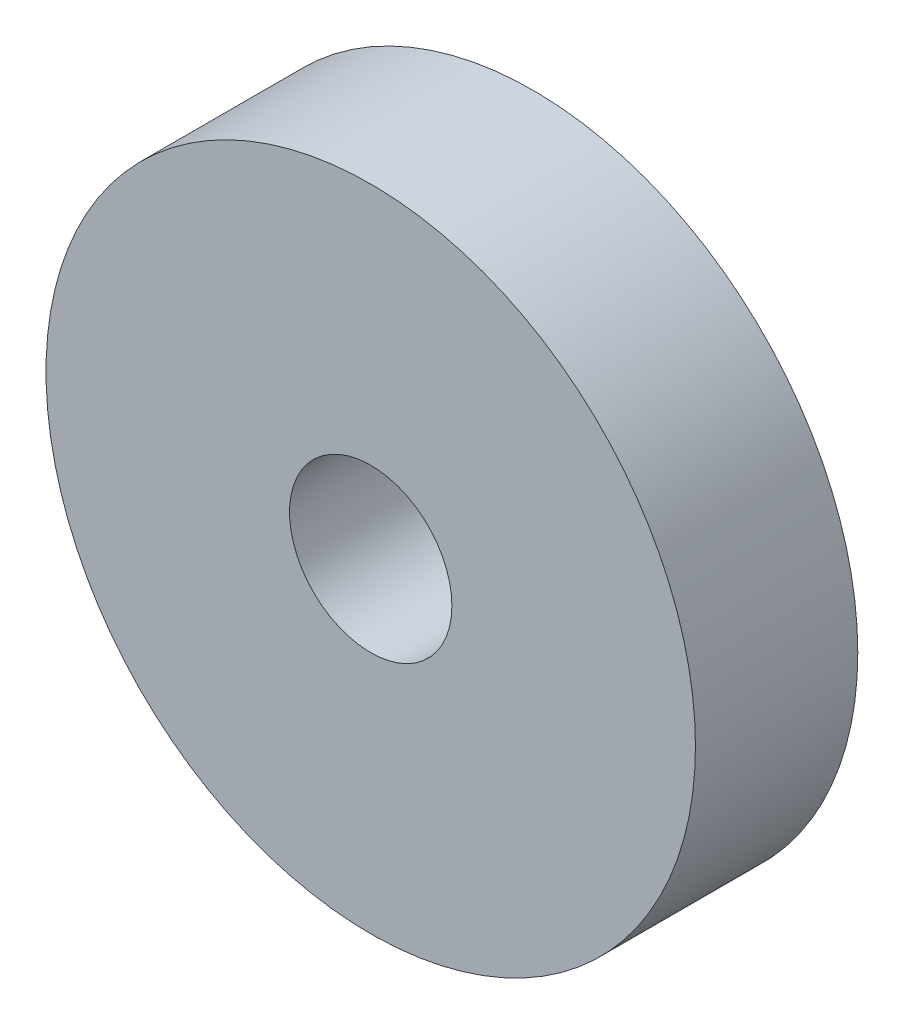
ISO-10303-21;
HEADER;
FILE_DESCRIPTION(('STEP AP214'),'2;1');
FILE_NAME('part.step','',(''),(''),'','','');
FILE_SCHEMA(('AUTOMOTIVE_DESIGN { 1 0 10303 214 1 1 1 1 }'));
ENDSEC;
DATA;
#1=APPLICATION_CONTEXT('core data for automotive mechanical design processes');
#2=APPLICATION_PROTOCOL_DEFINITION('international standard','automotive_design',2000,#1);
#3=PRODUCT_CONTEXT('',#1,'mechanical');
#4=PRODUCT('Part','Part','',(#3));
#5=PRODUCT_RELATED_PRODUCT_CATEGORY('part','',(#4));
#6=PRODUCT_DEFINITION_FORMATION('','',#4);
#7=PRODUCT_DEFINITION_CONTEXT('part definition',#1,'design');
#8=PRODUCT_DEFINITION('design','',#6,#7);
#9=PRODUCT_DEFINITION_SHAPE('','',#8);
#10=(LENGTH_UNIT() NAMED_UNIT(*) SI_UNIT(.MILLI.,.METRE.));
#11=(NAMED_UNIT(*) PLANE_ANGLE_UNIT() SI_UNIT($,.RADIAN.));
#12=(NAMED_UNIT(*) SI_UNIT($,.STERADIAN.) SOLID_ANGLE_UNIT());
#13=UNCERTAINTY_MEASURE_WITH_UNIT(LENGTH_MEASURE(1.E-05),#10,'distance_accuracy_value','');
#14=(GEOMETRIC_REPRESENTATION_CONTEXT(3) GLOBAL_UNCERTAINTY_ASSIGNED_CONTEXT((#13)) GLOBAL_UNIT_ASSIGNED_CONTEXT((#10,
#11,#12)) REPRESENTATION_CONTEXT('',''));
#15=CARTESIAN_POINT('',(0.,0.,0.));
#16=DIRECTION('',(0.,0.,1.));
#17=DIRECTION('',(1.,0.,0.));
#18=AXIS2_PLACEMENT_3D('',#15,#16,#17);
#19=CARTESIAN_POINT('',(0.,0.,6.35));
#20=DIRECTION('',(0.,0.,1.));
#21=DIRECTION('',(1.,0.,0.));
#22=AXIS2_PLACEMENT_3D('',#19,#20,#21);
#23=PLANE('',#22);
#24=CARTESIAN_POINT('',(0.,0.,6.35));
#25=DIRECTION('',(0.,0.,1.));
#26=DIRECTION('',(1.,0.,0.));
#27=AXIS2_PLACEMENT_3D('',#24,#25,#26);
#28=CIRCLE('',#27,12.7);
#29=CARTESIAN_POINT('',(12.7,0.,6.35));
#30=VERTEX_POINT('',#29);
#31=EDGE_CURVE('E10',#30,#30,#28,.T.);
#32=ORIENTED_EDGE('',*,*,#31,.T.);
#33=EDGE_LOOP('',(#32));
#34=FACE_BOUND('',#33,.T.);
#35=CARTESIAN_POINT('',(0.,0.,6.35));
#36=DIRECTION('',(0.,0.,1.));
#37=DIRECTION('',(1.,0.,0.));
#38=AXIS2_PLACEMENT_3D('',#35,#36,#37);
#39=CIRCLE('',#38,3.175);
#40=CARTESIAN_POINT('',(3.175,0.,6.35));
#41=VERTEX_POINT('',#40);
#42=EDGE_CURVE('E42',#41,#41,#39,.T.);
#43=ORIENTED_EDGE('',*,*,#42,.F.);
#44=EDGE_LOOP('',(#43));
#45=FACE_BOUND('',#44,.T.);
#46=ADVANCED_FACE('F31',(#34,#45),#23,.T.);
#47=CARTESIAN_POINT('',(0.,0.,0.));
#48=DIRECTION('',(0.,0.,1.));
#49=DIRECTION('',(1.,0.,0.));
#50=AXIS2_PLACEMENT_3D('',#47,#48,#49);
#51=PLANE('',#50);
#52=CARTESIAN_POINT('',(0.,0.,0.));
#53=DIRECTION('',(0.,0.,1.));
#54=DIRECTION('',(1.,0.,0.));
#55=AXIS2_PLACEMENT_3D('',#52,#53,#54);
#56=CIRCLE('',#55,12.7);
#57=CARTESIAN_POINT('',(12.7,0.,0.));
#58=VERTEX_POINT('',#57);
#59=EDGE_CURVE('E35',#58,#58,#56,.T.);
#60=ORIENTED_EDGE('',*,*,#59,.F.);
#61=EDGE_LOOP('',(#60));
#62=FACE_BOUND('',#61,.T.);
#63=CARTESIAN_POINT('',(0.,0.,0.));
#64=DIRECTION('',(0.,0.,1.));
#65=DIRECTION('',(1.,0.,0.));
#66=AXIS2_PLACEMENT_3D('',#63,#64,#65);
#67=CIRCLE('',#66,3.175);
#68=CARTESIAN_POINT('',(3.175,0.,0.));
#69=VERTEX_POINT('',#68);
#70=EDGE_CURVE('E44',#69,#69,#67,.T.);
#71=ORIENTED_EDGE('',*,*,#70,.T.);
#72=EDGE_LOOP('',(#71));
#73=FACE_BOUND('',#72,.T.);
#74=ADVANCED_FACE('F54',(#62,#73),#51,.F.);
#75=CARTESIAN_POINT('',(0.,0.,6.35));
#76=DIRECTION('',(0.,0.,-1.));
#77=DIRECTION('',(-1.,0.,0.));
#78=AXIS2_PLACEMENT_3D('',#75,#76,#77);
#79=CYLINDRICAL_SURFACE('',#78,12.7);
#80=ORIENTED_EDGE('',*,*,#31,.F.);
#81=EDGE_LOOP('',(#80));
#82=FACE_BOUND('',#81,.T.);
#83=ORIENTED_EDGE('',*,*,#59,.T.);
#84=EDGE_LOOP('',(#83));
#85=FACE_BOUND('',#84,.T.);
#86=ADVANCED_FACE('F33',(#82,#85),#79,.T.);
#87=CARTESIAN_POINT('',(0.,0.,6.35));
#88=DIRECTION('',(0.,0.,-1.));
#89=DIRECTION('',(-1.,0.,0.));
#90=AXIS2_PLACEMENT_3D('',#87,#88,#89);
#91=CYLINDRICAL_SURFACE('',#90,3.175);
#92=ORIENTED_EDGE('',*,*,#42,.T.);
#93=EDGE_LOOP('',(#92));
#94=FACE_BOUND('',#93,.T.);
#95=ORIENTED_EDGE('',*,*,#70,.F.);
#96=EDGE_LOOP('',(#95));
#97=FACE_BOUND('',#96,.T.);
#98=ADVANCED_FACE('F50',(#94,#97),#91,.F.);
#99=CLOSED_SHELL('',(#46,#74,#86,#98));
#100=MANIFOLD_SOLID_BREP('B2',#99);
#101=ADVANCED_BREP_SHAPE_REPRESENTATION('',(#18,#100),#14);
#102=SHAPE_DEFINITION_REPRESENTATION(#9,#101);
ENDSEC;
END-ISO-10303-21;
